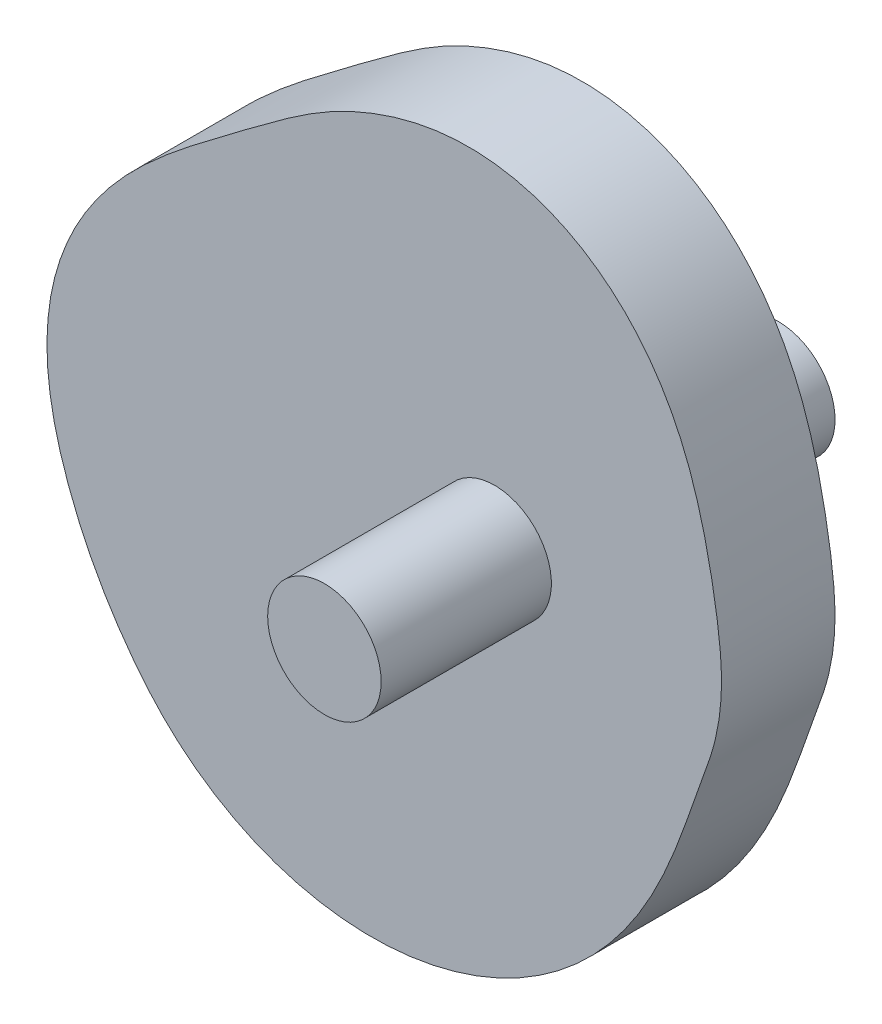
ISO-10303-21;
HEADER;
FILE_DESCRIPTION(('STEP AP214'),'2;1');
FILE_NAME('part.step','',(''),(''),'','','');
FILE_SCHEMA(('AUTOMOTIVE_DESIGN { 1 0 10303 214 1 1 1 1 }'));
ENDSEC;
DATA;
#1=APPLICATION_CONTEXT('core data for automotive mechanical design processes');
#2=APPLICATION_PROTOCOL_DEFINITION('international standard','automotive_design',2000,#1);
#3=PRODUCT_CONTEXT('',#1,'mechanical');
#4=PRODUCT('Part','Part','',(#3));
#5=PRODUCT_RELATED_PRODUCT_CATEGORY('part','',(#4));
#6=PRODUCT_DEFINITION_FORMATION('','',#4);
#7=PRODUCT_DEFINITION_CONTEXT('part definition',#1,'design');
#8=PRODUCT_DEFINITION('design','',#6,#7);
#9=PRODUCT_DEFINITION_SHAPE('','',#8);
#10=(LENGTH_UNIT() NAMED_UNIT(*) SI_UNIT(.MILLI.,.METRE.));
#11=(NAMED_UNIT(*) PLANE_ANGLE_UNIT() SI_UNIT($,.RADIAN.));
#12=(NAMED_UNIT(*) SI_UNIT($,.STERADIAN.) SOLID_ANGLE_UNIT());
#13=UNCERTAINTY_MEASURE_WITH_UNIT(LENGTH_MEASURE(1.E-05),#10,'distance_accuracy_value','');
#14=(GEOMETRIC_REPRESENTATION_CONTEXT(3) GLOBAL_UNCERTAINTY_ASSIGNED_CONTEXT((#13)) GLOBAL_UNIT_ASSIGNED_CONTEXT((#10,
#11,#12)) REPRESENTATION_CONTEXT('',''));
#15=CARTESIAN_POINT('',(0.,0.,0.));
#16=DIRECTION('',(0.,0.,1.));
#17=DIRECTION('',(1.,0.,0.));
#18=AXIS2_PLACEMENT_3D('',#15,#16,#17);
#19=CARTESIAN_POINT('',(0.,0.,20.));
#20=DIRECTION('',(0.,0.,-1.));
#21=DIRECTION('',(-1.,0.,0.));
#22=AXIS2_PLACEMENT_3D('',#19,#20,#21);
#23=CYLINDRICAL_SURFACE('',#22,5.);
#24=CARTESIAN_POINT('',(0.,0.,20.));
#25=DIRECTION('',(0.,0.,1.));
#26=DIRECTION('',(1.,0.,0.));
#27=AXIS2_PLACEMENT_3D('',#24,#25,#26);
#28=CIRCLE('',#27,5.);
#29=CARTESIAN_POINT('',(5.,0.,20.));
#30=VERTEX_POINT('',#29);
#31=EDGE_CURVE('E49',#30,#30,#28,.T.);
#32=ORIENTED_EDGE('',*,*,#31,.F.);
#33=EDGE_LOOP('',(#32));
#34=FACE_BOUND('',#33,.T.);
#35=CARTESIAN_POINT('',(0.,0.,5.));
#36=DIRECTION('',(0.,0.,-1.));
#37=DIRECTION('',(-1.,0.,0.));
#38=AXIS2_PLACEMENT_3D('',#35,#36,#37);
#39=CIRCLE('',#38,5.);
#40=CARTESIAN_POINT('',(-5.,0.,5.));
#41=VERTEX_POINT('',#40);
#42=EDGE_CURVE('E10',#41,#41,#39,.T.);
#43=ORIENTED_EDGE('',*,*,#42,.F.);
#44=EDGE_LOOP('',(#43));
#45=FACE_BOUND('',#44,.T.);
#46=ADVANCED_FACE('F41',(#34,#45),#23,.T.);
#47=CARTESIAN_POINT('',(0.,0.,20.));
#48=DIRECTION('',(0.,0.,1.));
#49=DIRECTION('',(1.,0.,0.));
#50=AXIS2_PLACEMENT_3D('',#47,#48,#49);
#51=PLANE('',#50);
#52=ORIENTED_EDGE('',*,*,#31,.T.);
#53=EDGE_LOOP('',(#52));
#54=FACE_BOUND('',#53,.T.);
#55=ADVANCED_FACE('F90',(#54),#51,.T.);
#56=CARTESIAN_POINT('',(19.9970280025258,0.349049422155474,5.));
#57=CARTESIAN_POINT('',(19.9931418668048,0.581738082009154,5.));
#58=CARTESIAN_POINT('',(19.9777432878052,1.0470376652458,5.));
#59=CARTESIAN_POINT('',(19.9353637484638,1.74424592177702,5.));
#60=CARTESIAN_POINT('',(19.8764272491788,2.44078444494658,5.));
#61=CARTESIAN_POINT('',(19.8033707259386,3.13701038117276,5.));
#62=CARTESIAN_POINT('',(19.7181744353811,3.83354615180453,5.));
#63=CARTESIAN_POINT('',(19.622401218606,4.53121693427803,5.));
#64=CARTESIAN_POINT('',(19.5171876876365,5.23099057235675,5.));
#65=CARTESIAN_POINT('',(19.403255460251,5.93392012884889,5.));
#66=CARTESIAN_POINT('',(19.2809238133568,6.64108955125438,5.));
#67=CARTESIAN_POINT('',(19.1501283596757,7.35356276694062,5.));
#68=CARTESIAN_POINT('',(19.0104440198648,8.07233649233508,5.));
#69=CARTESIAN_POINT('',(18.8611121946041,8.79829699383704,5.));
#70=CARTESIAN_POINT('',(18.7010715390678,9.5321810133791,5.));
#71=CARTESIAN_POINT('',(18.5289918375485,10.2745410529523,5.));
#72=CARTESIAN_POINT('',(18.3433104320695,11.0257151953946,5.));
#73=CARTESIAN_POINT('',(18.1422706721433,11.7858016164203,5.));
#74=CARTESIAN_POINT('',(17.9239618637826,12.5546379122337,5.));
#75=CARTESIAN_POINT('',(17.6863602138475,13.3317853280107,5.));
#76=CARTESIAN_POINT('',(17.4273702829839,14.1165179272575,5.));
#77=CARTESIAN_POINT('',(17.1448664760361,14.9078166936381,5.));
#78=CARTESIAN_POINT('',(16.8367341125062,15.7043685081796,5.));
#79=CARTESIAN_POINT('',(16.5009096323244,16.5045698979074,5.));
#80=CARTESIAN_POINT('',(16.1354195051355,17.306535408097,5.));
#81=CARTESIAN_POINT('',(15.7384174256312,18.1081104099103,5.));
#82=CARTESIAN_POINT('',(15.3082193939478,18.9068881181733,5.));
#83=CARTESIAN_POINT('',(14.8433362992982,19.7002305602364,5.));
#84=CARTESIAN_POINT('',(14.342503646879,20.4852932059196,5.));
#85=CARTESIAN_POINT('',(13.8047080926667,21.2590529402803,5.));
#86=CARTESIAN_POINT('',(13.22921047772,22.0183390351483,5.));
#87=CARTESIAN_POINT('',(12.6155650827671,22.7598667519738,5.));
#88=CARTESIAN_POINT('',(11.9636348548726,23.4802731874714,5.));
#89=CARTESIAN_POINT('',(11.273602390531,24.1761549547905,5.));
#90=CARTESIAN_POINT('',(10.5459764933465,24.8441072764651,5.));
#91=CARTESIAN_POINT('',(9.78159415932828,25.4807640511824,5.));
#92=CARTESIAN_POINT('',(8.9816178785231,26.0828384443694,5.));
#93=CARTESIAN_POINT('',(8.14752817817127,26.6471635427155,5.));
#94=CARTESIAN_POINT('',(7.28111136970457,27.1707326049338,5.));
#95=CARTESIAN_POINT('',(6.38444249975986,27.6507384353221,5.));
#96=CARTESIAN_POINT('',(5.45986354401632,28.0846114030454,5.));
#97=CARTESIAN_POINT('',(4.50995692217554,28.4700556286411,5.));
#98=CARTESIAN_POINT('',(3.5375144528831,28.8050828603324,5.));
#99=CARTESIAN_POINT('',(2.54550190885173,29.0880435665681,5.));
#100=CARTESIAN_POINT('',(1.53701937470848,29.3176547785494,5.));
#101=CARTESIAN_POINT('',(0.515257653153535,29.4930242268777,5.));
#102=CARTESIAN_POINT('',(-0.516548992879759,29.6136703338482,5.));
#103=CARTESIAN_POINT('',(-1.55517342928117,29.6795376348796,5.));
#104=CARTESIAN_POINT('',(-2.59744920883762,29.691007257114,5.));
#105=CARTESIAN_POINT('',(-3.64032665707849,29.6489020017151,5.));
#106=CARTESIAN_POINT('',(-4.68093116532921,29.5544860265479,5.));
#107=CARTESIAN_POINT('',(-5.71662276322426,29.4094576096004,5.));
#108=CARTESIAN_POINT('',(-6.74505817951472,29.2159393270236,5.));
#109=CARTESIAN_POINT('',(-7.7642485100527,28.9764483122513,5.));
#110=CARTESIAN_POINT('',(-8.77263574947491,28.6939104149642,5.));
#111=CARTESIAN_POINT('',(-9.7690984262149,28.3714794203083,5.));
#112=CARTESIAN_POINT('',(-10.7532068570463,28.0130569641474,5.));
#113=CARTESIAN_POINT('',(-11.7243179941648,27.620764727693,5.));
#114=CARTESIAN_POINT('',(-12.6811246933851,27.1947575853302,5.));
#115=CARTESIAN_POINT('',(-13.6224703456206,26.7356065975834,5.));
#116=CARTESIAN_POINT('',(-14.5472845396345,26.2439900261296,5.));
#117=CARTESIAN_POINT('',(-15.4541466913432,25.7199670813834,5.));
#118=CARTESIAN_POINT('',(-16.343608929949,25.1667765672331,5.));
#119=CARTESIAN_POINT('',(-17.2187213756562,24.5904147102096,5.));
#120=CARTESIAN_POINT('',(-18.082684051343,23.9955459477266,5.));
#121=CARTESIAN_POINT('',(-18.9391868392331,23.3862206227192,5.));
#122=CARTESIAN_POINT('',(-19.7920888654691,22.76553013223,5.));
#123=CARTESIAN_POINT('',(-20.6452545264285,22.1355914620761,5.));
#124=CARTESIAN_POINT('',(-21.5023412616026,21.4974884098737,5.));
#125=CARTESIAN_POINT('',(-22.3666048399562,20.8512716499771,5.));
#126=CARTESIAN_POINT('',(-23.2407146906317,20.1959914319888,5.));
#127=CARTESIAN_POINT('',(-24.1265902765774,19.5297698975572,5.));
#128=CARTESIAN_POINT('',(-25.0252628012347,18.849909068372,5.));
#129=CARTESIAN_POINT('',(-25.936766668613,18.1530310481951,5.));
#130=CARTESIAN_POINT('',(-26.8600637977526,17.4352443821321,5.));
#131=CARTESIAN_POINT('',(-27.7930033506259,16.6923293048977,5.));
#132=CARTESIAN_POINT('',(-28.7323187594028,15.9199338724844,5.));
#133=CARTESIAN_POINT('',(-29.6736630586997,15.1137729260253,5.));
#134=CARTESIAN_POINT('',(-30.6116823236306,14.2698221876712,5.));
#135=CARTESIAN_POINT('',(-31.540125594473,13.3845003681861,5.));
#136=CARTESIAN_POINT('',(-32.4519882000243,12.4548328683731,5.));
#137=CARTESIAN_POINT('',(-33.3396840327828,11.47859145845,5.));
#138=CARTESIAN_POINT('',(-34.1952411851634,10.4544052262002,5.));
#139=CARTESIAN_POINT('',(-35.0105144785447,9.38183909650284,5.));
#140=CARTESIAN_POINT('',(-35.7774078161464,8.26143732354897,5.));
#141=CARTESIAN_POINT('',(-36.4880989492952,7.09473051125765,5.));
#142=CARTESIAN_POINT('',(-37.1352591311979,5.88420589595761,5.));
#143=CARTESIAN_POINT('',(-37.7122602063532,4.63324181139839,5.));
#144=CARTESIAN_POINT('',(-38.2133619234094,3.34600845336997,5.));
#145=CARTESIAN_POINT('',(-38.6338726719186,2.02733828625427,5.));
#146=CARTESIAN_POINT('',(-38.970277474462,0.682570693465071,5.));
#147=CARTESIAN_POINT('',(-39.2203279968769,-0.682623271053812,5.));
#148=CARTESIAN_POINT('',(-39.3830906177795,-2.06242901685724,5.));
#149=CARTESIAN_POINT('',(-39.4589503140323,-3.45108155621086,5.));
#150=CARTESIAN_POINT('',(-39.4495698805929,-4.84305524869111,5.));
#151=CARTESIAN_POINT('',(-39.357806754679,-6.23324211284189,5.));
#152=CARTESIAN_POINT('',(-39.1875890155399,-7.61711033938971,5.));
#153=CARTESIAN_POINT('',(-38.9437635338692,-8.99083938995205,5.));
#154=CARTESIAN_POINT('',(-38.6318938146048,-10.3514157604108,5.));
#155=CARTESIAN_POINT('',(-38.2581225861506,-11.6967259723821,5.));
#156=CARTESIAN_POINT('',(-37.82870411057,-13.0254934810983,5.));
#157=CARTESIAN_POINT('',(-37.3507242670099,-14.3376025433606,5.));
#158=CARTESIAN_POINT('',(-36.827692871757,-15.632426781987,5.));
#159=CARTESIAN_POINT('',(-36.259668795309,-16.9081618574039,5.));
#160=CARTESIAN_POINT('',(-35.647500835803,-18.1633086061651,5.));
#161=CARTESIAN_POINT('',(-34.991893666687,-19.3963236554268,5.));
#162=CARTESIAN_POINT('',(-34.2936542109038,-20.6057056312487,5.));
#163=CARTESIAN_POINT('',(-33.5536416582048,-21.7899917979917,5.));
#164=CARTESIAN_POINT('',(-32.7727154631791,-22.9476955803911,5.));
#165=CARTESIAN_POINT('',(-31.9519871184369,-24.0775706046948,5.));
#166=CARTESIAN_POINT('',(-31.091869892128,-25.1776129547086,5.));
#167=CARTESIAN_POINT('',(-30.1957041521423,-26.2487006480583,5.));
#168=CARTESIAN_POINT('',(-29.240673774742,-27.267617810269,5.));
#169=CARTESIAN_POINT('',(-28.2325655529565,-28.2329400441287,5.));
#170=CARTESIAN_POINT('',(-27.1740698102571,-29.1411728619181,5.));
#171=CARTESIAN_POINT('',(-26.0690008535989,-29.9896732533634,5.));
#172=CARTESIAN_POINT('',(-24.9211182893739,-30.7759136571095,5.));
#173=CARTESIAN_POINT('',(-23.7344096902494,-31.4977009993997,5.));
#174=CARTESIAN_POINT('',(-22.5129846560113,-32.1531334254403,5.));
#175=CARTESIAN_POINT('',(-21.2610716775454,-32.7406245827495,5.));
#176=CARTESIAN_POINT('',(-19.9829865822884,-33.2589071300494,5.));
#177=CARTESIAN_POINT('',(-18.6831078840201,-33.7070390197292,5.));
#178=CARTESIAN_POINT('',(-17.365849839381,-34.0844062134223,5.));
#179=CARTESIAN_POINT('',(-16.0356359132598,-34.3907234982916,5.));
#180=CARTESIAN_POINT('',(-14.6968721780823,-34.6260329542001,5.));
#181=CARTESIAN_POINT('',(-13.3539210194498,-34.7907002086049,5.));
#182=CARTESIAN_POINT('',(-12.0110752919004,-34.8854084807317,5.));
#183=CARTESIAN_POINT('',(-10.6725331251336,-34.9111504735685,5.));
#184=CARTESIAN_POINT('',(-9.34237355976376,-34.8692181774511,5.));
#185=CARTESIAN_POINT('',(-8.02453318939198,-34.7611906674021,5.));
#186=CARTESIAN_POINT('',(-6.72278397677656,-34.5889199904807,5.));
#187=CARTESIAN_POINT('',(-5.44071240306675,-34.3545152537214,5.));
#188=CARTESIAN_POINT('',(-4.18170009868405,-34.0603250364495,5.));
#189=CARTESIAN_POINT('',(-2.94890609305717,-33.7089182630806,5.));
#190=CARTESIAN_POINT('',(-1.74525080799405,-33.3030636837887,5.));
#191=CARTESIAN_POINT('',(-0.573401906138335,-32.8457081205676,5.));
#192=CARTESIAN_POINT('',(0.56423790820731,-32.3399536451753,5.));
#193=CARTESIAN_POINT('',(1.66554105348844,-31.7890338631347,5.));
#194=CARTESIAN_POINT('',(2.72866313362747,-31.1962894843462,5.));
#195=CARTESIAN_POINT('',(3.75204884814679,-30.5651433658765,5.));
#196=CARTESIAN_POINT('',(4.7344357151264,-29.8990752160994,5.));
#197=CARTESIAN_POINT('',(5.67485558905057,-29.2015961515506,5.));
#198=CARTESIAN_POINT('',(6.57263397235183,-28.4762232986001,5.));
#199=CARTESIAN_POINT('',(7.42738713622411,-27.7264546313515,5.));
#200=CARTESIAN_POINT('',(8.23901708291812,-26.9557442350352,5.));
#201=CARTESIAN_POINT('',(9.00770439815095,-26.167478180623,5.));
#202=CARTESIAN_POINT('',(9.73389905829648,-25.3649511914561,5.));
#203=CARTESIAN_POINT('',(10.418309272602,-24.5513442764211,5.));
#204=CARTESIAN_POINT('',(11.0618884556276,-23.7297034966748,5.));
#205=CARTESIAN_POINT('',(11.6658204393465,-22.9029200241804,5.));
#206=CARTESIAN_POINT('',(12.2315030477393,-22.0737116404714,5.));
#207=CARTESIAN_POINT('',(12.760530169129,-21.2446058131855,5.));
#208=CARTESIAN_POINT('',(13.2546724728385,-20.4179244761295,5.));
#209=CARTESIAN_POINT('',(13.7158569268163,-19.595770626033,5.));
#210=CARTESIAN_POINT('',(14.1461452815785,-18.7800168358422,5.));
#211=CARTESIAN_POINT('',(14.5477116929326,-17.9722957704614,5.));
#212=CARTESIAN_POINT('',(14.9228196613031,-17.1739927762925,5.));
#213=CARTESIAN_POINT('',(15.2737984690753,-16.3862406008027,5.));
#214=CARTESIAN_POINT('',(15.6030192982701,-15.6099162822674,5.));
#215=CARTESIAN_POINT('',(15.9128712119466,-14.8456402335416,5.));
#216=CARTESIAN_POINT('',(16.2057371734063,-14.0937775233115,5.));
#217=CARTESIAN_POINT('',(16.483970296614,-13.3544413462151,5.));
#218=CARTESIAN_POINT('',(16.7498704301579,-12.6274986226393,5.));
#219=CARTESIAN_POINT('',(17.0056614826934,-11.9125777481546,5.));
#220=CARTESIAN_POINT('',(17.2534687693744,-11.2090781124628,5.));
#221=CARTESIAN_POINT('',(17.4952997458626,-10.5161823415238,5.));
#222=CARTESIAN_POINT('',(17.7330166294419,-9.83286724608391,5.));
#223=CARTESIAN_POINT('',(17.9683436894677,-9.15792749829118,5.));
#224=CARTESIAN_POINT('',(18.2027533259265,-8.4899599588642,5.));
#225=CARTESIAN_POINT('',(18.4378048680458,-7.82749936599764,5.));
#226=CARTESIAN_POINT('',(18.6738132187132,-7.16861702353132,5.));
#227=CARTESIAN_POINT('',(18.9145912975534,-6.51286668021516,5.));
#228=CARTESIAN_POINT('',(19.1298761483467,-5.84857896268303,5.));
#229=CARTESIAN_POINT('',(19.3224678129037,-5.17744367130085,5.));
#230=CARTESIAN_POINT('',(19.4913517547268,-4.4999317644161,5.));
#231=CARTESIAN_POINT('',(19.6365329424173,-3.81695579229853,5.));
#232=CARTESIAN_POINT('',(19.7577784893237,-3.12932451157517,5.));
#233=CARTESIAN_POINT('',(19.8549539717046,-2.43788196622858,5.));
#234=CARTESIAN_POINT('',(19.9279438208164,-1.74346883212817,5.));
#235=CARTESIAN_POINT('',(19.9766345160394,-1.04693183497776,5.));
#236=CARTESIAN_POINT('',(20.0010623007072,-0.349118144841944,5.));
#237=CARTESIAN_POINT('',(20.0009139352009,0.11637292000342,5.));
#238=CARTESIAN_POINT('',(19.9970280025258,0.349049422155474,5.));
#239=B_SPLINE_CURVE_WITH_KNOTS('',3,(#56,#57,#58,#59,#60,#61,#62,#63,#64,#65,#66,#67,#68,#69,
#70,#71,#72,#73,#74,#75,#76,#77,#78,#79,#80,#81,#82,#83,#84,#85,#86,#87,#88,#89,#90,#91,#92,#93,
#94,#95,#96,#97,#98,#99,#100,#101,#102,#103,#104,#105,#106,#107,#108,#109,#110,#111,#112,#113,
#114,#115,#116,#117,#118,#119,#120,#121,#122,#123,#124,#125,#126,#127,#128,#129,#130,#131,#132,
#133,#134,#135,#136,#137,#138,#139,#140,#141,#142,#143,#144,#145,#146,#147,#148,#149,#150,#151,
#152,#153,#154,#155,#156,#157,#158,#159,#160,#161,#162,#163,#164,#165,#166,#167,#168,#169,#170,
#171,#172,#173,#174,#175,#176,#177,#178,#179,#180,#181,#182,#183,#184,#185,#186,#187,#188,#189,
#190,#191,#192,#193,#194,#195,#196,#197,#198,#199,#200,#201,#202,#203,#204,#205,#206,#207,#208,
#209,#210,#211,#212,#213,#214,#215,#216,#217,#218,#219,#220,#221,#222,#223,#224,#225,#226,#227,
#228,#229,#230,#231,#232,#233,#234,#235,#236,#237,#238),.UNSPECIFIED.,.T.,.F.,(4,1,1,1,1,1,1,1,
1,1,1,1,1,1,1,1,1,1,1,1,1,1,1,1,1,1,1,1,1,1,1,1,1,1,1,1,1,1,1,1,1,1,1,1,1,1,1,1,1,1,1,1,1,1,1,1,
1,1,1,1,1,1,1,1,1,1,1,1,1,1,1,1,1,1,1,1,1,1,1,1,1,1,1,1,1,1,1,1,1,1,1,1,1,1,1,1,1,1,1,1,1,1,1,1,
1,1,1,1,1,1,1,1,1,1,1,1,1,1,1,1,1,1,1,1,1,1,1,1,1,1,1,1,1,1,1,1,1,1,1,1,1,1,1,1,1,1,1,1,1,1,1,1,
1,1,1,1,1,1,1,1,1,1,1,1,1,1,1,1,1,1,1,1,1,1,1,1,1,1,1,1,4),(0.,0.0036232836803576,
0.00724751393202011,0.0108743048114781,0.0145061800074318,0.018146550947235,0.0217996387474942,
0.0254703514649148,0.0291641282186603,0.0328867619027933,0.0366442120540516,0.0404424187555388,
0.04428712715787,0.0481837303577783,0.0521371361835095,0.0561516611502488,0.0602309527146145,
0.0643779391637732,0.0685948051265122,0.0728829898117632,0.0772432046207257,0.0816754666597622,
0.0861791448065892,0.0907530152608694,0.095395323866087,0.10010385286595,0.104875990117534,
0.109708799102747,0.11459908834928,0.119543479090154,0.124538470160908,0.129580499262226,
0.134665999811919,0.139791452683006,0.144953432183918,0.150148645692004,0.155373966412165,
0.160626458807559,0.165903396347517,0.171202271347187,0.176520796840742,0.181856900641362,
0.187208712000718,0.192574541591329,0.197952855898101,0.203342247520591,0.208741403354551,
0.214149073139631,0.219564041430795,0.224985106677319,0.23041107178143,0.235840751267988,
0.241273001037259,0.246706777601783,0.252141234721197,0.257575859474582,0.263010490927098,
0.268445122379614,0.27387975383213,0.279314385284645,0.284749028414578,0.290184012413334,
0.295620786845508,0.301062663055702,0.30651518447378,0.311986293078648,0.317486258348141,
0.323027348954753,0.328623260369019,0.33428834673515,0.340036735397705,0.345881419928941,
0.351833428224164,0.357901146935673,0.364089857365538,0.370401508072621,0.376834722179791,
0.383385016448044,0.390045195610468,0.396805878302583,0.403656108444254,0.410584006423575,
0.417577416694516,0.424624511814418,0.431714317409927,0.438837128298832,0.445984793362707,
0.453150856016853,0.460330548206232,0.467520648237246,0.474719225360172,0.481925305322534,
0.489138499424177,0.49635864345443,0.503585491443278,0.510818502447469,0.51805674751513,
0.525298950027402,0.532543657515202,0.539789528362274,0.547035692026434,0.554281867296455,
0.561528042566476,0.568774217836497,0.576020393106518,0.583266568376539,0.59051274364656,
0.597758918916581,0.605005094186602,0.612251269456623,0.619497156160431,0.626741624251623,
0.633982828747946,0.641218579409436,0.648446664438455,0.655664842269046,0.662870833763244,
0.670062314922934,0.677236910220381,0.684392186644121,0.691525648549721,0.698634733397093,
0.705716808447821,0.712769168487479,0.719789034629382,0.726773554247802,0.733719802080543,
0.740624782533133,0.747485433209796,0.754298629690058,0.761061191564351,0.767769889737435,
0.774421455004969,0.781012587906142,0.787539969853995,0.794000275545006,0.800390186650559,
0.806706406795248,0.812945677830345,0.819104797415297,0.825180637925562,0.831170166711375,
0.837070467738816,0.842878764651514,0.848592445297942,0.854209087774723,0.859726488039833,
0.865142689149463,0.870456012167036,0.875665088779752,0.880768895634293,0.885766790364711,
0.890658549227447,0.895444406175013,0.900125093084606,0.904701880703861,0.909176619676581,
0.913551780761792,0.917830493058877,0.922016578705585,0.926114582140547,0.930129791648021,
0.934068250578141,0.937936755427906,0.941742837958629,0.945494728801443,0.949201300636814,
0.952871990060645,0.95651669863642,0.960145675263734,0.963769116916747,0.967392204551758,
0.971015292186768,0.974638379821778,0.978261467456789,0.9818845550918,0.98550764272681,
0.98913073036182,0.992753817996831,0.996376905631841,1.),.UNSPECIFIED.);
#240=DIRECTION('',(0.,0.,-1.));
#241=VECTOR('',#240,1.);
#242=SURFACE_OF_LINEAR_EXTRUSION('',#239,#241);
#243=CARTESIAN_POINT('',(19.9970280025258,0.349049422155474,5.));
#244=VERTEX_POINT('',#243);
#245=EDGE_CURVE('E69',#244,#244,#239,.T.);
#246=ORIENTED_EDGE('',*,*,#245,.F.);
#247=EDGE_LOOP('',(#246));
#248=FACE_BOUND('',#247,.T.);
#249=CARTESIAN_POINT('',(19.9970280025258,0.349049422155474,-5.));
#250=CARTESIAN_POINT('',(19.9931418668048,0.581738082009154,-5.));
#251=CARTESIAN_POINT('',(19.9777432878052,1.0470376652458,-5.));
#252=CARTESIAN_POINT('',(19.9353637484638,1.74424592177702,-5.));
#253=CARTESIAN_POINT('',(19.8764272491788,2.44078444494658,-5.));
#254=CARTESIAN_POINT('',(19.8033707259386,3.13701038117276,-5.));
#255=CARTESIAN_POINT('',(19.7181744353811,3.83354615180453,-5.));
#256=CARTESIAN_POINT('',(19.622401218606,4.53121693427803,-5.));
#257=CARTESIAN_POINT('',(19.5171876876365,5.23099057235675,-5.));
#258=CARTESIAN_POINT('',(19.403255460251,5.93392012884889,-5.));
#259=CARTESIAN_POINT('',(19.2809238133568,6.64108955125438,-5.));
#260=CARTESIAN_POINT('',(19.1501283596757,7.35356276694062,-5.));
#261=CARTESIAN_POINT('',(19.0104440198648,8.07233649233508,-5.));
#262=CARTESIAN_POINT('',(18.8611121946041,8.79829699383704,-5.));
#263=CARTESIAN_POINT('',(18.7010715390678,9.5321810133791,-5.));
#264=CARTESIAN_POINT('',(18.5289918375485,10.2745410529523,-5.));
#265=CARTESIAN_POINT('',(18.3433104320695,11.0257151953946,-5.));
#266=CARTESIAN_POINT('',(18.1422706721433,11.7858016164203,-5.));
#267=CARTESIAN_POINT('',(17.9239618637826,12.5546379122337,-5.));
#268=CARTESIAN_POINT('',(17.6863602138475,13.3317853280107,-5.));
#269=CARTESIAN_POINT('',(17.4273702829839,14.1165179272575,-5.));
#270=CARTESIAN_POINT('',(17.1448664760361,14.9078166936381,-5.));
#271=CARTESIAN_POINT('',(16.8367341125062,15.7043685081796,-5.));
#272=CARTESIAN_POINT('',(16.5009096323244,16.5045698979074,-5.));
#273=CARTESIAN_POINT('',(16.1354195051355,17.306535408097,-5.));
#274=CARTESIAN_POINT('',(15.7384174256312,18.1081104099103,-5.));
#275=CARTESIAN_POINT('',(15.3082193939478,18.9068881181733,-5.));
#276=CARTESIAN_POINT('',(14.8433362992982,19.7002305602364,-5.));
#277=CARTESIAN_POINT('',(14.342503646879,20.4852932059196,-5.));
#278=CARTESIAN_POINT('',(13.8047080926667,21.2590529402803,-5.));
#279=CARTESIAN_POINT('',(13.22921047772,22.0183390351483,-5.));
#280=CARTESIAN_POINT('',(12.6155650827671,22.7598667519738,-5.));
#281=CARTESIAN_POINT('',(11.9636348548726,23.4802731874714,-5.));
#282=CARTESIAN_POINT('',(11.273602390531,24.1761549547905,-5.));
#283=CARTESIAN_POINT('',(10.5459764933465,24.8441072764651,-5.));
#284=CARTESIAN_POINT('',(9.78159415932828,25.4807640511824,-5.));
#285=CARTESIAN_POINT('',(8.9816178785231,26.0828384443694,-5.));
#286=CARTESIAN_POINT('',(8.14752817817127,26.6471635427155,-5.));
#287=CARTESIAN_POINT('',(7.28111136970457,27.1707326049338,-5.));
#288=CARTESIAN_POINT('',(6.38444249975986,27.6507384353221,-5.));
#289=CARTESIAN_POINT('',(5.45986354401632,28.0846114030454,-5.));
#290=CARTESIAN_POINT('',(4.50995692217554,28.4700556286411,-5.));
#291=CARTESIAN_POINT('',(3.5375144528831,28.8050828603324,-5.));
#292=CARTESIAN_POINT('',(2.54550190885173,29.0880435665681,-5.));
#293=CARTESIAN_POINT('',(1.53701937470848,29.3176547785494,-5.));
#294=CARTESIAN_POINT('',(0.515257653153535,29.4930242268777,-5.));
#295=CARTESIAN_POINT('',(-0.516548992879759,29.6136703338482,-5.));
#296=CARTESIAN_POINT('',(-1.55517342928117,29.6795376348796,-5.));
#297=CARTESIAN_POINT('',(-2.59744920883762,29.691007257114,-5.));
#298=CARTESIAN_POINT('',(-3.64032665707849,29.6489020017151,-5.));
#299=CARTESIAN_POINT('',(-4.68093116532921,29.5544860265479,-5.));
#300=CARTESIAN_POINT('',(-5.71662276322426,29.4094576096004,-5.));
#301=CARTESIAN_POINT('',(-6.74505817951472,29.2159393270236,-5.));
#302=CARTESIAN_POINT('',(-7.7642485100527,28.9764483122513,-5.));
#303=CARTESIAN_POINT('',(-8.77263574947491,28.6939104149642,-5.));
#304=CARTESIAN_POINT('',(-9.7690984262149,28.3714794203083,-5.));
#305=CARTESIAN_POINT('',(-10.7532068570463,28.0130569641474,-5.));
#306=CARTESIAN_POINT('',(-11.7243179941648,27.620764727693,-5.));
#307=CARTESIAN_POINT('',(-12.6811246933851,27.1947575853302,-5.));
#308=CARTESIAN_POINT('',(-13.6224703456206,26.7356065975834,-5.));
#309=CARTESIAN_POINT('',(-14.5472845396345,26.2439900261296,-5.));
#310=CARTESIAN_POINT('',(-15.4541466913432,25.7199670813834,-5.));
#311=CARTESIAN_POINT('',(-16.343608929949,25.1667765672331,-5.));
#312=CARTESIAN_POINT('',(-17.2187213756562,24.5904147102096,-5.));
#313=CARTESIAN_POINT('',(-18.082684051343,23.9955459477266,-5.));
#314=CARTESIAN_POINT('',(-18.9391868392331,23.3862206227192,-5.));
#315=CARTESIAN_POINT('',(-19.7920888654691,22.76553013223,-5.));
#316=CARTESIAN_POINT('',(-20.6452545264285,22.1355914620761,-5.));
#317=CARTESIAN_POINT('',(-21.5023412616026,21.4974884098737,-5.));
#318=CARTESIAN_POINT('',(-22.3666048399562,20.8512716499771,-5.));
#319=CARTESIAN_POINT('',(-23.2407146906317,20.1959914319888,-5.));
#320=CARTESIAN_POINT('',(-24.1265902765774,19.5297698975572,-5.));
#321=CARTESIAN_POINT('',(-25.0252628012347,18.849909068372,-5.));
#322=CARTESIAN_POINT('',(-25.936766668613,18.1530310481951,-5.));
#323=CARTESIAN_POINT('',(-26.8600637977526,17.4352443821321,-5.));
#324=CARTESIAN_POINT('',(-27.7930033506259,16.6923293048977,-5.));
#325=CARTESIAN_POINT('',(-28.7323187594028,15.9199338724844,-5.));
#326=CARTESIAN_POINT('',(-29.6736630586997,15.1137729260253,-5.));
#327=CARTESIAN_POINT('',(-30.6116823236306,14.2698221876712,-5.));
#328=CARTESIAN_POINT('',(-31.540125594473,13.3845003681861,-5.));
#329=CARTESIAN_POINT('',(-32.4519882000243,12.4548328683731,-5.));
#330=CARTESIAN_POINT('',(-33.3396840327828,11.47859145845,-5.));
#331=CARTESIAN_POINT('',(-34.1952411851634,10.4544052262002,-5.));
#332=CARTESIAN_POINT('',(-35.0105144785447,9.38183909650284,-5.));
#333=CARTESIAN_POINT('',(-35.7774078161464,8.26143732354897,-5.));
#334=CARTESIAN_POINT('',(-36.4880989492952,7.09473051125765,-5.));
#335=CARTESIAN_POINT('',(-37.1352591311979,5.88420589595761,-5.));
#336=CARTESIAN_POINT('',(-37.7122602063532,4.63324181139839,-5.));
#337=CARTESIAN_POINT('',(-38.2133619234094,3.34600845336997,-5.));
#338=CARTESIAN_POINT('',(-38.6338726719186,2.02733828625427,-5.));
#339=CARTESIAN_POINT('',(-38.970277474462,0.682570693465071,-5.));
#340=CARTESIAN_POINT('',(-39.2203279968769,-0.682623271053812,-5.));
#341=CARTESIAN_POINT('',(-39.3830906177795,-2.06242901685724,-5.));
#342=CARTESIAN_POINT('',(-39.4589503140323,-3.45108155621086,-5.));
#343=CARTESIAN_POINT('',(-39.4495698805929,-4.84305524869111,-5.));
#344=CARTESIAN_POINT('',(-39.357806754679,-6.23324211284189,-5.));
#345=CARTESIAN_POINT('',(-39.1875890155399,-7.61711033938971,-5.));
#346=CARTESIAN_POINT('',(-38.9437635338692,-8.99083938995205,-5.));
#347=CARTESIAN_POINT('',(-38.6318938146048,-10.3514157604108,-5.));
#348=CARTESIAN_POINT('',(-38.2581225861506,-11.6967259723821,-5.));
#349=CARTESIAN_POINT('',(-37.82870411057,-13.0254934810983,-5.));
#350=CARTESIAN_POINT('',(-37.3507242670099,-14.3376025433606,-5.));
#351=CARTESIAN_POINT('',(-36.827692871757,-15.632426781987,-5.));
#352=CARTESIAN_POINT('',(-36.259668795309,-16.9081618574039,-5.));
#353=CARTESIAN_POINT('',(-35.647500835803,-18.1633086061651,-5.));
#354=CARTESIAN_POINT('',(-34.991893666687,-19.3963236554268,-5.));
#355=CARTESIAN_POINT('',(-34.2936542109038,-20.6057056312487,-5.));
#356=CARTESIAN_POINT('',(-33.5536416582048,-21.7899917979917,-5.));
#357=CARTESIAN_POINT('',(-32.7727154631791,-22.9476955803911,-5.));
#358=CARTESIAN_POINT('',(-31.9519871184369,-24.0775706046948,-5.));
#359=CARTESIAN_POINT('',(-31.091869892128,-25.1776129547086,-5.));
#360=CARTESIAN_POINT('',(-30.1957041521423,-26.2487006480583,-5.));
#361=CARTESIAN_POINT('',(-29.240673774742,-27.267617810269,-5.));
#362=CARTESIAN_POINT('',(-28.2325655529565,-28.2329400441287,-5.));
#363=CARTESIAN_POINT('',(-27.1740698102571,-29.1411728619181,-5.));
#364=CARTESIAN_POINT('',(-26.0690008535989,-29.9896732533634,-5.));
#365=CARTESIAN_POINT('',(-24.9211182893739,-30.7759136571095,-5.));
#366=CARTESIAN_POINT('',(-23.7344096902494,-31.4977009993997,-5.));
#367=CARTESIAN_POINT('',(-22.5129846560113,-32.1531334254403,-5.));
#368=CARTESIAN_POINT('',(-21.2610716775454,-32.7406245827495,-5.));
#369=CARTESIAN_POINT('',(-19.9829865822884,-33.2589071300494,-5.));
#370=CARTESIAN_POINT('',(-18.6831078840201,-33.7070390197292,-5.));
#371=CARTESIAN_POINT('',(-17.365849839381,-34.0844062134223,-5.));
#372=CARTESIAN_POINT('',(-16.0356359132598,-34.3907234982916,-5.));
#373=CARTESIAN_POINT('',(-14.6968721780823,-34.6260329542001,-5.));
#374=CARTESIAN_POINT('',(-13.3539210194498,-34.7907002086049,-5.));
#375=CARTESIAN_POINT('',(-12.0110752919004,-34.8854084807317,-5.));
#376=CARTESIAN_POINT('',(-10.6725331251336,-34.9111504735685,-5.));
#377=CARTESIAN_POINT('',(-9.34237355976376,-34.8692181774511,-5.));
#378=CARTESIAN_POINT('',(-8.02453318939198,-34.7611906674021,-5.));
#379=CARTESIAN_POINT('',(-6.72278397677656,-34.5889199904807,-5.));
#380=CARTESIAN_POINT('',(-5.44071240306675,-34.3545152537214,-5.));
#381=CARTESIAN_POINT('',(-4.18170009868405,-34.0603250364495,-5.));
#382=CARTESIAN_POINT('',(-2.94890609305717,-33.7089182630806,-5.));
#383=CARTESIAN_POINT('',(-1.74525080799405,-33.3030636837887,-5.));
#384=CARTESIAN_POINT('',(-0.573401906138335,-32.8457081205676,-5.));
#385=CARTESIAN_POINT('',(0.56423790820731,-32.3399536451753,-5.));
#386=CARTESIAN_POINT('',(1.66554105348844,-31.7890338631347,-5.));
#387=CARTESIAN_POINT('',(2.72866313362747,-31.1962894843462,-5.));
#388=CARTESIAN_POINT('',(3.75204884814679,-30.5651433658765,-5.));
#389=CARTESIAN_POINT('',(4.7344357151264,-29.8990752160994,-5.));
#390=CARTESIAN_POINT('',(5.67485558905057,-29.2015961515506,-5.));
#391=CARTESIAN_POINT('',(6.57263397235183,-28.4762232986001,-5.));
#392=CARTESIAN_POINT('',(7.42738713622411,-27.7264546313515,-5.));
#393=CARTESIAN_POINT('',(8.23901708291812,-26.9557442350352,-5.));
#394=CARTESIAN_POINT('',(9.00770439815095,-26.167478180623,-5.));
#395=CARTESIAN_POINT('',(9.73389905829648,-25.3649511914561,-5.));
#396=CARTESIAN_POINT('',(10.418309272602,-24.5513442764211,-5.));
#397=CARTESIAN_POINT('',(11.0618884556276,-23.7297034966748,-5.));
#398=CARTESIAN_POINT('',(11.6658204393465,-22.9029200241804,-5.));
#399=CARTESIAN_POINT('',(12.2315030477393,-22.0737116404714,-5.));
#400=CARTESIAN_POINT('',(12.760530169129,-21.2446058131855,-5.));
#401=CARTESIAN_POINT('',(13.2546724728385,-20.4179244761295,-5.));
#402=CARTESIAN_POINT('',(13.7158569268163,-19.595770626033,-5.));
#403=CARTESIAN_POINT('',(14.1461452815785,-18.7800168358422,-5.));
#404=CARTESIAN_POINT('',(14.5477116929326,-17.9722957704614,-5.));
#405=CARTESIAN_POINT('',(14.9228196613031,-17.1739927762925,-5.));
#406=CARTESIAN_POINT('',(15.2737984690753,-16.3862406008027,-5.));
#407=CARTESIAN_POINT('',(15.6030192982701,-15.6099162822674,-5.));
#408=CARTESIAN_POINT('',(15.9128712119466,-14.8456402335416,-5.));
#409=CARTESIAN_POINT('',(16.2057371734063,-14.0937775233115,-5.));
#410=CARTESIAN_POINT('',(16.483970296614,-13.3544413462151,-5.));
#411=CARTESIAN_POINT('',(16.7498704301579,-12.6274986226393,-5.));
#412=CARTESIAN_POINT('',(17.0056614826934,-11.9125777481546,-5.));
#413=CARTESIAN_POINT('',(17.2534687693744,-11.2090781124628,-5.));
#414=CARTESIAN_POINT('',(17.4952997458626,-10.5161823415238,-5.));
#415=CARTESIAN_POINT('',(17.7330166294419,-9.83286724608391,-5.));
#416=CARTESIAN_POINT('',(17.9683436894677,-9.15792749829118,-5.));
#417=CARTESIAN_POINT('',(18.2027533259265,-8.4899599588642,-5.));
#418=CARTESIAN_POINT('',(18.4378048680458,-7.82749936599764,-5.));
#419=CARTESIAN_POINT('',(18.6738132187132,-7.16861702353132,-5.));
#420=CARTESIAN_POINT('',(18.9145912975534,-6.51286668021516,-5.));
#421=CARTESIAN_POINT('',(19.1298761483467,-5.84857896268303,-5.));
#422=CARTESIAN_POINT('',(19.3224678129037,-5.17744367130085,-5.));
#423=CARTESIAN_POINT('',(19.4913517547268,-4.4999317644161,-5.));
#424=CARTESIAN_POINT('',(19.6365329424173,-3.81695579229853,-5.));
#425=CARTESIAN_POINT('',(19.7577784893237,-3.12932451157517,-5.));
#426=CARTESIAN_POINT('',(19.8549539717046,-2.43788196622858,-5.));
#427=CARTESIAN_POINT('',(19.9279438208164,-1.74346883212817,-5.));
#428=CARTESIAN_POINT('',(19.9766345160394,-1.04693183497776,-5.));
#429=CARTESIAN_POINT('',(20.0010623007072,-0.349118144841944,-5.));
#430=CARTESIAN_POINT('',(20.0009139352009,0.11637292000342,-5.));
#431=CARTESIAN_POINT('',(19.9970280025258,0.349049422155474,-5.));
#432=B_SPLINE_CURVE_WITH_KNOTS('',3,(#249,#250,#251,#252,#253,#254,#255,#256,#257,#258,#259,
#260,#261,#262,#263,#264,#265,#266,#267,#268,#269,#270,#271,#272,#273,#274,#275,#276,#277,#278,
#279,#280,#281,#282,#283,#284,#285,#286,#287,#288,#289,#290,#291,#292,#293,#294,#295,#296,#297,
#298,#299,#300,#301,#302,#303,#304,#305,#306,#307,#308,#309,#310,#311,#312,#313,#314,#315,#316,
#317,#318,#319,#320,#321,#322,#323,#324,#325,#326,#327,#328,#329,#330,#331,#332,#333,#334,#335,
#336,#337,#338,#339,#340,#341,#342,#343,#344,#345,#346,#347,#348,#349,#350,#351,#352,#353,#354,
#355,#356,#357,#358,#359,#360,#361,#362,#363,#364,#365,#366,#367,#368,#369,#370,#371,#372,#373,
#374,#375,#376,#377,#378,#379,#380,#381,#382,#383,#384,#385,#386,#387,#388,#389,#390,#391,#392,
#393,#394,#395,#396,#397,#398,#399,#400,#401,#402,#403,#404,#405,#406,#407,#408,#409,#410,#411,
#412,#413,#414,#415,#416,#417,#418,#419,#420,#421,#422,#423,#424,#425,#426,#427,#428,#429,#430,
#431),.UNSPECIFIED.,.T.,.F.,(4,1,1,1,1,1,1,1,1,1,1,1,1,1,1,1,1,1,1,1,1,1,1,1,1,1,1,1,1,1,1,1,1,
1,1,1,1,1,1,1,1,1,1,1,1,1,1,1,1,1,1,1,1,1,1,1,1,1,1,1,1,1,1,1,1,1,1,1,1,1,1,1,1,1,1,1,1,1,1,1,1,
1,1,1,1,1,1,1,1,1,1,1,1,1,1,1,1,1,1,1,1,1,1,1,1,1,1,1,1,1,1,1,1,1,1,1,1,1,1,1,1,1,1,1,1,1,1,1,1,
1,1,1,1,1,1,1,1,1,1,1,1,1,1,1,1,1,1,1,1,1,1,1,1,1,1,1,1,1,1,1,1,1,1,1,1,1,1,1,1,1,1,1,1,1,1,1,1,
1,1,1,4),(0.,0.0036232836803576,0.00724751393202011,0.0108743048114781,0.0145061800074318,
0.018146550947235,0.0217996387474942,0.0254703514649148,0.0291641282186603,0.0328867619027933,
0.0366442120540516,0.0404424187555388,0.04428712715787,0.0481837303577783,0.0521371361835095,
0.0561516611502488,0.0602309527146145,0.0643779391637732,0.0685948051265122,0.0728829898117632,
0.0772432046207257,0.0816754666597622,0.0861791448065892,0.0907530152608694,0.095395323866087,
0.10010385286595,0.104875990117534,0.109708799102747,0.11459908834928,0.119543479090154,
0.124538470160908,0.129580499262226,0.134665999811919,0.139791452683006,0.144953432183918,
0.150148645692004,0.155373966412165,0.160626458807559,0.165903396347517,0.171202271347187,
0.176520796840742,0.181856900641362,0.187208712000718,0.192574541591329,0.197952855898101,
0.203342247520591,0.208741403354551,0.214149073139631,0.219564041430795,0.224985106677319,
0.23041107178143,0.235840751267988,0.241273001037259,0.246706777601783,0.252141234721197,
0.257575859474582,0.263010490927098,0.268445122379614,0.27387975383213,0.279314385284645,
0.284749028414578,0.290184012413334,0.295620786845508,0.301062663055702,0.30651518447378,
0.311986293078648,0.317486258348141,0.323027348954753,0.328623260369019,0.33428834673515,
0.340036735397705,0.345881419928941,0.351833428224164,0.357901146935673,0.364089857365538,
0.370401508072621,0.376834722179791,0.383385016448044,0.390045195610468,0.396805878302583,
0.403656108444254,0.410584006423575,0.417577416694516,0.424624511814418,0.431714317409927,
0.438837128298832,0.445984793362707,0.453150856016853,0.460330548206232,0.467520648237246,
0.474719225360172,0.481925305322534,0.489138499424177,0.49635864345443,0.503585491443278,
0.510818502447469,0.51805674751513,0.525298950027402,0.532543657515202,0.539789528362274,
0.547035692026434,0.554281867296455,0.561528042566476,0.568774217836497,0.576020393106518,
0.583266568376539,0.59051274364656,0.597758918916581,0.605005094186602,0.612251269456623,
0.619497156160431,0.626741624251623,0.633982828747946,0.641218579409436,0.648446664438455,
0.655664842269046,0.662870833763244,0.670062314922934,0.677236910220381,0.684392186644121,
0.691525648549721,0.698634733397093,0.705716808447821,0.712769168487479,0.719789034629382,
0.726773554247802,0.733719802080543,0.740624782533133,0.747485433209796,0.754298629690058,
0.761061191564351,0.767769889737435,0.774421455004969,0.781012587906142,0.787539969853995,
0.794000275545006,0.800390186650559,0.806706406795248,0.812945677830345,0.819104797415297,
0.825180637925562,0.831170166711375,0.837070467738816,0.842878764651514,0.848592445297942,
0.854209087774723,0.859726488039833,0.865142689149463,0.870456012167036,0.875665088779752,
0.880768895634293,0.885766790364711,0.890658549227447,0.895444406175013,0.900125093084606,
0.904701880703861,0.909176619676581,0.913551780761792,0.917830493058877,0.922016578705585,
0.926114582140547,0.930129791648021,0.934068250578141,0.937936755427906,0.941742837958629,
0.945494728801443,0.949201300636814,0.952871990060645,0.95651669863642,0.960145675263734,
0.963769116916747,0.967392204551758,0.971015292186768,0.974638379821778,0.978261467456789,
0.9818845550918,0.98550764272681,0.98913073036182,0.992753817996831,0.996376905631841,1.),.UNSPECIFIED.);
#433=CARTESIAN_POINT('',(19.9970280025258,0.349049422155474,-5.));
#434=VERTEX_POINT('',#433);
#435=EDGE_CURVE('E63',#434,#434,#432,.T.);
#436=ORIENTED_EDGE('',*,*,#435,.T.);
#437=EDGE_LOOP('',(#436));
#438=FACE_BOUND('',#437,.T.);
#439=ADVANCED_FACE('F85',(#248,#438),#242,.F.);
#440=CARTESIAN_POINT('',(-39.4000144370326,-5.54288791886246,5.));
#441=DIRECTION('',(0.,0.,-1.));
#442=DIRECTION('',(-1.,0.,0.));
#443=AXIS2_PLACEMENT_3D('',#440,#441,#442);
#444=PLANE('',#443);
#445=ORIENTED_EDGE('',*,*,#42,.T.);
#446=EDGE_LOOP('',(#445));
#447=FACE_BOUND('',#446,.T.);
#448=ORIENTED_EDGE('',*,*,#245,.T.);
#449=EDGE_LOOP('',(#448));
#450=FACE_BOUND('',#449,.T.);
#451=ADVANCED_FACE('F89',(#447,#450),#444,.F.);
#452=CARTESIAN_POINT('',(-39.4000144370326,-5.54288791886246,-5.));
#453=DIRECTION('',(0.,0.,-1.));
#454=DIRECTION('',(-1.,0.,0.));
#455=AXIS2_PLACEMENT_3D('',#452,#453,#454);
#456=PLANE('',#455);
#457=CARTESIAN_POINT('',(0.,0.,-5.));
#458=DIRECTION('',(0.,0.,-1.));
#459=DIRECTION('',(-1.,0.,0.));
#460=AXIS2_PLACEMENT_3D('',#457,#458,#459);
#461=CIRCLE('',#460,5.);
#462=CARTESIAN_POINT('',(-5.,0.,-5.));
#463=VERTEX_POINT('',#462);
#464=EDGE_CURVE('E60',#463,#463,#461,.T.);
#465=ORIENTED_EDGE('',*,*,#464,.F.);
#466=EDGE_LOOP('',(#465));
#467=FACE_BOUND('',#466,.T.);
#468=ORIENTED_EDGE('',*,*,#435,.F.);
#469=EDGE_LOOP('',(#468));
#470=FACE_BOUND('',#469,.T.);
#471=ADVANCED_FACE('F92',(#467,#470),#456,.T.);
#472=CARTESIAN_POINT('',(0.,0.,-20.));
#473=DIRECTION('',(0.,0.,1.));
#474=DIRECTION('',(1.,0.,0.));
#475=AXIS2_PLACEMENT_3D('',#472,#473,#474);
#476=PLANE('',#475);
#477=CARTESIAN_POINT('',(0.,0.,-20.));
#478=DIRECTION('',(0.,0.,1.));
#479=DIRECTION('',(1.,0.,0.));
#480=AXIS2_PLACEMENT_3D('',#477,#478,#479);
#481=CIRCLE('',#480,5.);
#482=CARTESIAN_POINT('',(5.,0.,-20.));
#483=VERTEX_POINT('',#482);
#484=EDGE_CURVE('E54',#483,#483,#481,.T.);
#485=ORIENTED_EDGE('',*,*,#484,.F.);
#486=EDGE_LOOP('',(#485));
#487=FACE_BOUND('',#486,.T.);
#488=ADVANCED_FACE('F95',(#487),#476,.F.);
#489=ORIENTED_EDGE('',*,*,#464,.T.);
#490=EDGE_LOOP('',(#489));
#491=FACE_BOUND('',#490,.T.);
#492=ORIENTED_EDGE('',*,*,#484,.T.);
#493=EDGE_LOOP('',(#492));
#494=FACE_BOUND('',#493,.T.);
#495=ADVANCED_FACE('F43',(#491,#494),#23,.T.);
#496=CLOSED_SHELL('',(#46,#55,#439,#451,#471,#488,#495));
#497=MANIFOLD_SOLID_BREP('B2',#496);
#498=ADVANCED_BREP_SHAPE_REPRESENTATION('',(#18,#497),#14);
#499=SHAPE_DEFINITION_REPRESENTATION(#9,#498);
ENDSEC;
END-ISO-10303-21;
